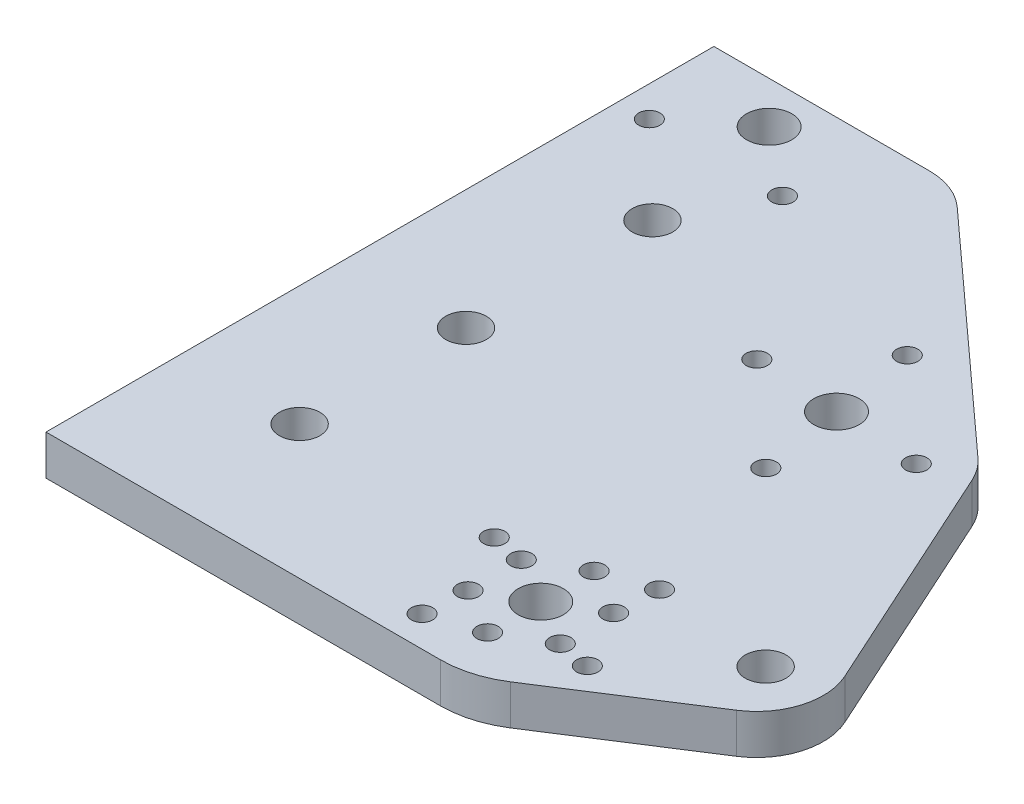
ISO-10303-21;
HEADER;
FILE_DESCRIPTION(('STEP AP214'),'2;1');
FILE_NAME('part.step','',(''),(''),'','','');
FILE_SCHEMA(('AUTOMOTIVE_DESIGN { 1 0 10303 214 1 1 1 1 }'));
ENDSEC;
DATA;
#1=APPLICATION_CONTEXT('core data for automotive mechanical design processes');
#2=APPLICATION_PROTOCOL_DEFINITION('international standard','automotive_design',2000,#1);
#3=PRODUCT_CONTEXT('',#1,'mechanical');
#4=PRODUCT('Part','Part','',(#3));
#5=PRODUCT_RELATED_PRODUCT_CATEGORY('part','',(#4));
#6=PRODUCT_DEFINITION_FORMATION('','',#4);
#7=PRODUCT_DEFINITION_CONTEXT('part definition',#1,'design');
#8=PRODUCT_DEFINITION('design','',#6,#7);
#9=PRODUCT_DEFINITION_SHAPE('','',#8);
#10=(LENGTH_UNIT() NAMED_UNIT(*) SI_UNIT(.MILLI.,.METRE.));
#11=(NAMED_UNIT(*) PLANE_ANGLE_UNIT() SI_UNIT($,.RADIAN.));
#12=(NAMED_UNIT(*) SI_UNIT($,.STERADIAN.) SOLID_ANGLE_UNIT());
#13=UNCERTAINTY_MEASURE_WITH_UNIT(LENGTH_MEASURE(1.E-05),#10,'distance_accuracy_value','');
#14=(GEOMETRIC_REPRESENTATION_CONTEXT(3) GLOBAL_UNCERTAINTY_ASSIGNED_CONTEXT((#13)) GLOBAL_UNIT_ASSIGNED_CONTEXT((#10,
#11,#12)) REPRESENTATION_CONTEXT('',''));
#15=CARTESIAN_POINT('',(0.,0.,0.));
#16=DIRECTION('',(0.,0.,1.));
#17=DIRECTION('',(1.,0.,0.));
#18=AXIS2_PLACEMENT_3D('',#15,#16,#17);
#19=CARTESIAN_POINT('',(0.,0.,-51.3));
#20=DIRECTION('',(0.,0.,-1.));
#21=DIRECTION('',(-1.,0.,0.));
#22=AXIS2_PLACEMENT_3D('',#19,#20,#21);
#23=PLANE('',#22);
#24=DIRECTION('',(1.,0.,0.));
#25=VECTOR('',#24,1.);
#26=CARTESIAN_POINT('',(0.,-6.,-51.3));
#27=LINE('',#26,#25);
#28=CARTESIAN_POINT('',(75.4374299499424,-6.,-51.3));
#29=VERTEX_POINT('',#28);
#30=CARTESIAN_POINT('',(107.856417313653,-6.,-51.3));
#31=VERTEX_POINT('',#30);
#32=EDGE_CURVE('E206',#29,#31,#27,.T.);
#33=ORIENTED_EDGE('',*,*,#32,.F.);
#34=DIRECTION('',(0.,-1.,0.));
#35=VECTOR('',#34,1.);
#36=CARTESIAN_POINT('',(75.4374299499424,0.,-51.3));
#37=LINE('',#36,#35);
#38=CARTESIAN_POINT('',(75.4374299499424,0.,-51.3));
#39=VERTEX_POINT('',#38);
#40=EDGE_CURVE('E11',#39,#29,#37,.T.);
#41=ORIENTED_EDGE('',*,*,#40,.F.);
#42=DIRECTION('',(1.,0.,0.));
#43=VECTOR('',#42,1.);
#44=CARTESIAN_POINT('',(0.,0.,-51.3));
#45=LINE('',#44,#43);
#46=CARTESIAN_POINT('',(107.856417313653,0.,-51.3));
#47=VERTEX_POINT('',#46);
#48=EDGE_CURVE('E245',#39,#47,#45,.T.);
#49=ORIENTED_EDGE('',*,*,#48,.T.);
#50=DIRECTION('',(0.,-1.,0.));
#51=VECTOR('',#50,1.);
#52=CARTESIAN_POINT('',(107.856417313653,0.,-51.3));
#53=LINE('',#52,#51);
#54=EDGE_CURVE('E39',#47,#31,#53,.T.);
#55=ORIENTED_EDGE('',*,*,#54,.T.);
#56=EDGE_LOOP('',(#33,#41,#49,#55));
#57=FACE_BOUND('',#56,.T.);
#58=ADVANCED_FACE('F35',(#57),#23,.T.);
#59=CARTESIAN_POINT('',(75.4374299499424,0.,0.));
#60=DIRECTION('',(-1.,0.,0.));
#61=DIRECTION('',(0.,0.,1.));
#62=AXIS2_PLACEMENT_3D('',#59,#60,#61);
#63=PLANE('',#62);
#64=DIRECTION('',(0.,0.,-1.));
#65=VECTOR('',#64,1.);
#66=CARTESIAN_POINT('',(75.4374299499424,-6.,0.));
#67=LINE('',#66,#65);
#68=CARTESIAN_POINT('',(75.4374299499424,-6.,49.0269199289563));
#69=VERTEX_POINT('',#68);
#70=EDGE_CURVE('E230',#69,#29,#67,.T.);
#71=ORIENTED_EDGE('',*,*,#70,.F.);
#72=DIRECTION('',(0.,-1.,0.));
#73=VECTOR('',#72,1.);
#74=CARTESIAN_POINT('',(75.4374299499424,0.,49.0269199289563));
#75=LINE('',#74,#73);
#76=CARTESIAN_POINT('',(75.4374299499424,0.,49.0269199289563));
#77=VERTEX_POINT('',#76);
#78=EDGE_CURVE('E45',#77,#69,#75,.T.);
#79=ORIENTED_EDGE('',*,*,#78,.F.);
#80=DIRECTION('',(0.,0.,-1.));
#81=VECTOR('',#80,1.);
#82=CARTESIAN_POINT('',(75.4374299499424,0.,0.));
#83=LINE('',#82,#81);
#84=EDGE_CURVE('E135',#77,#39,#83,.T.);
#85=ORIENTED_EDGE('',*,*,#84,.T.);
#86=ORIENTED_EDGE('',*,*,#40,.T.);
#87=EDGE_LOOP('',(#71,#79,#85,#86));
#88=FACE_BOUND('',#87,.T.);
#89=ADVANCED_FACE('F249',(#88),#63,.T.);
#90=CARTESIAN_POINT('',(0.,0.,49.0269199289563));
#91=DIRECTION('',(0.,0.,1.));
#92=DIRECTION('',(1.,0.,0.));
#93=AXIS2_PLACEMENT_3D('',#90,#91,#92);
#94=PLANE('',#93);
#95=DIRECTION('',(-1.,0.,0.));
#96=VECTOR('',#95,1.);
#97=CARTESIAN_POINT('',(0.,-6.,49.0269199289563));
#98=LINE('',#97,#96);
#99=CARTESIAN_POINT('',(134.666145804438,-6.,49.0269199289563));
#100=VERTEX_POINT('',#99);
#101=EDGE_CURVE('E122',#100,#69,#98,.T.);
#102=ORIENTED_EDGE('',*,*,#101,.F.);
#103=DIRECTION('',(0.,-1.,0.));
#104=VECTOR('',#103,1.);
#105=CARTESIAN_POINT('',(134.666145804438,0.,49.0269199289563));
#106=LINE('',#105,#104);
#107=CARTESIAN_POINT('',(134.666145804438,0.,49.0269199289563));
#108=VERTEX_POINT('',#107);
#109=EDGE_CURVE('E117',#108,#100,#106,.T.);
#110=ORIENTED_EDGE('',*,*,#109,.F.);
#111=DIRECTION('',(-1.,0.,0.));
#112=VECTOR('',#111,1.);
#113=CARTESIAN_POINT('',(0.,0.,49.0269199289563));
#114=LINE('',#113,#112);
#115=EDGE_CURVE('E120',#108,#77,#114,.T.);
#116=ORIENTED_EDGE('',*,*,#115,.T.);
#117=ORIENTED_EDGE('',*,*,#78,.T.);
#118=EDGE_LOOP('',(#102,#110,#116,#117));
#119=FACE_BOUND('',#118,.T.);
#120=ADVANCED_FACE('F119',(#119),#94,.T.);
#121=CARTESIAN_POINT('',(134.666145804438,0.,33.9329989561975));
#122=DIRECTION('',(0.,-1.,0.));
#123=DIRECTION('',(0.,0.,-1.));
#124=AXIS2_PLACEMENT_3D('',#121,#122,#123);
#125=CYLINDRICAL_SURFACE('',#124,15.0939209727588);
#126=CARTESIAN_POINT('',(134.666145804438,-6.,33.9329989561975));
#127=DIRECTION('',(0.,-1.,0.));
#128=DIRECTION('',(0.,0.,-1.));
#129=AXIS2_PLACEMENT_3D('',#126,#127,#128);
#130=CIRCLE('',#129,15.0939209727588);
#131=CARTESIAN_POINT('',(142.828800475843,-6.,46.6293574517381));
#132=VERTEX_POINT('',#131);
#133=EDGE_CURVE('E227',#132,#100,#130,.T.);
#134=ORIENTED_EDGE('',*,*,#133,.F.);
#135=DIRECTION('',(0.,-1.,0.));
#136=VECTOR('',#135,1.);
#137=CARTESIAN_POINT('',(142.828800475843,0.,46.6293574517381));
#138=LINE('',#137,#136);
#139=CARTESIAN_POINT('',(142.828800475843,0.,46.6293574517381));
#140=VERTEX_POINT('',#139);
#141=EDGE_CURVE('E127',#140,#132,#138,.T.);
#142=ORIENTED_EDGE('',*,*,#141,.F.);
#143=CARTESIAN_POINT('',(134.666145804438,0.,33.9329989561975));
#144=DIRECTION('',(0.,-1.,0.));
#145=DIRECTION('',(0.,0.,-1.));
#146=AXIS2_PLACEMENT_3D('',#143,#144,#145);
#147=CIRCLE('',#146,15.0939209727588);
#148=EDGE_CURVE('E133',#140,#108,#147,.T.);
#149=ORIENTED_EDGE('',*,*,#148,.T.);
#150=ORIENTED_EDGE('',*,*,#109,.T.);
#151=EDGE_LOOP('',(#134,#142,#149,#150));
#152=FACE_BOUND('',#151,.T.);
#153=ADVANCED_FACE('F137',(#152),#125,.T.);
#154=CARTESIAN_POINT('',(62.9821951457657,0.,97.9637826904602));
#155=DIRECTION('',(0.540790871115351,0.,0.841157080287802));
#156=DIRECTION('',(0.841157080287802,0.,-0.540790871115351));
#157=AXIS2_PLACEMENT_3D('',#154,#155,#156);
#158=PLANE('',#157);
#159=DIRECTION('',(-0.841157080287802,0.,0.540790871115351));
#160=VECTOR('',#159,1.);
#161=CARTESIAN_POINT('',(62.9821951457657,-6.,97.9637826904602));
#162=LINE('',#161,#160);
#163=CARTESIAN_POINT('',(163.500492356446,-6.,33.3392568016729));
#164=VERTEX_POINT('',#163);
#165=EDGE_CURVE('E224',#164,#132,#162,.T.);
#166=ORIENTED_EDGE('',*,*,#165,.F.);
#167=DIRECTION('',(0.,-1.,0.));
#168=VECTOR('',#167,1.);
#169=CARTESIAN_POINT('',(163.500492356446,0.,33.3392568016729));
#170=LINE('',#169,#168);
#171=CARTESIAN_POINT('',(163.500492356446,0.,33.3392568016729));
#172=VERTEX_POINT('',#171);
#173=EDGE_CURVE('E236',#172,#164,#170,.T.);
#174=ORIENTED_EDGE('',*,*,#173,.F.);
#175=DIRECTION('',(-0.841157080287802,0.,0.540790871115351));
#176=VECTOR('',#175,1.);
#177=CARTESIAN_POINT('',(62.9821951457657,0.,97.9637826904602));
#178=LINE('',#177,#176);
#179=EDGE_CURVE('E138',#172,#140,#178,.T.);
#180=ORIENTED_EDGE('',*,*,#179,.T.);
#181=ORIENTED_EDGE('',*,*,#141,.T.);
#182=EDGE_LOOP('',(#166,#174,#180,#181));
#183=FACE_BOUND('',#182,.T.);
#184=ADVANCED_FACE('F263',(#183),#158,.T.);
#185=CARTESIAN_POINT('',(158.092583645293,0.,24.9276859987951));
#186=DIRECTION('',(0.,-1.,0.));
#187=DIRECTION('',(0.,0.,-1.));
#188=AXIS2_PLACEMENT_3D('',#185,#186,#187);
#189=CYLINDRICAL_SURFACE('',#188,9.99999999999987);
#190=CARTESIAN_POINT('',(158.092583645293,-6.,24.9276859987951));
#191=DIRECTION('',(0.,-1.,0.));
#192=DIRECTION('',(0.,0.,-1.));
#193=AXIS2_PLACEMENT_3D('',#190,#191,#192);
#194=CIRCLE('',#193,9.99999999999987);
#195=CARTESIAN_POINT('',(167.194797105098,-6.,20.7864651483518));
#196=VERTEX_POINT('',#195);
#197=EDGE_CURVE('E221',#196,#164,#194,.T.);
#198=ORIENTED_EDGE('',*,*,#197,.F.);
#199=DIRECTION('',(0.,-1.,0.));
#200=VECTOR('',#199,1.);
#201=CARTESIAN_POINT('',(167.194797105098,0.,20.7864651483518));
#202=LINE('',#201,#200);
#203=CARTESIAN_POINT('',(167.194797105098,0.,20.7864651483518));
#204=VERTEX_POINT('',#203);
#205=EDGE_CURVE('E238',#204,#196,#202,.T.);
#206=ORIENTED_EDGE('',*,*,#205,.F.);
#207=CARTESIAN_POINT('',(158.092583645293,0.,24.9276859987951));
#208=DIRECTION('',(0.,-1.,0.));
#209=DIRECTION('',(0.,0.,-1.));
#210=AXIS2_PLACEMENT_3D('',#207,#208,#209);
#211=CIRCLE('',#210,9.99999999999987);
#212=EDGE_CURVE('E140',#204,#172,#211,.T.);
#213=ORIENTED_EDGE('',*,*,#212,.T.);
#214=ORIENTED_EDGE('',*,*,#173,.T.);
#215=EDGE_LOOP('',(#198,#206,#213,#214));
#216=FACE_BOUND('',#215,.T.);
#217=ADVANCED_FACE('F266',(#216),#189,.T.);
#218=CARTESIAN_POINT('',(130.686066467596,0.,-59.4580500345281));
#219=DIRECTION('',(0.910221345980489,0.,-0.414122085044335));
#220=DIRECTION('',(-0.414122085044335,0.,-0.910221345980489));
#221=AXIS2_PLACEMENT_3D('',#218,#219,#220);
#222=PLANE('',#221);
#223=DIRECTION('',(0.414122085044335,0.,0.910221345980489));
#224=VECTOR('',#223,1.);
#225=CARTESIAN_POINT('',(130.686066467596,-6.,-59.4580500345281));
#226=LINE('',#225,#224);
#227=CARTESIAN_POINT('',(151.23570711883,-6.,-14.2908825530368));
#228=VERTEX_POINT('',#227);
#229=EDGE_CURVE('E218',#228,#196,#226,.T.);
#230=ORIENTED_EDGE('',*,*,#229,.F.);
#231=DIRECTION('',(0.,-1.,0.));
#232=VECTOR('',#231,1.);
#233=CARTESIAN_POINT('',(151.23570711883,0.,-14.2908825530368));
#234=LINE('',#233,#232);
#235=CARTESIAN_POINT('',(151.23570711883,0.,-14.2908825530368));
#236=VERTEX_POINT('',#235);
#237=EDGE_CURVE('E240',#236,#228,#234,.T.);
#238=ORIENTED_EDGE('',*,*,#237,.F.);
#239=DIRECTION('',(0.414122085044335,0.,0.910221345980489));
#240=VECTOR('',#239,1.);
#241=CARTESIAN_POINT('',(130.686066467596,0.,-59.4580500345281));
#242=LINE('',#241,#240);
#243=EDGE_CURVE('E526',#236,#204,#242,.T.);
#244=ORIENTED_EDGE('',*,*,#243,.T.);
#245=ORIENTED_EDGE('',*,*,#205,.T.);
#246=EDGE_LOOP('',(#230,#238,#244,#245));
#247=FACE_BOUND('',#246,.T.);
#248=ADVANCED_FACE('F270',(#247),#222,.T.);
#249=CARTESIAN_POINT('',(142.133493659026,0.,-10.1496617025925));
#250=DIRECTION('',(0.,-1.,0.));
#251=DIRECTION('',(0.,0.,-1.));
#252=AXIS2_PLACEMENT_3D('',#249,#250,#251);
#253=CYLINDRICAL_SURFACE('',#252,9.99999999999989);
#254=CARTESIAN_POINT('',(142.133493659026,-6.,-10.1496617025925));
#255=DIRECTION('',(0.,-1.,0.));
#256=DIRECTION('',(0.,0.,-1.));
#257=AXIS2_PLACEMENT_3D('',#254,#255,#256);
#258=CIRCLE('',#257,9.99999999999989);
#259=CARTESIAN_POINT('',(148.858963727558,-6.,-17.5502057607874));
#260=VERTEX_POINT('',#259);
#261=EDGE_CURVE('E215',#260,#228,#258,.T.);
#262=ORIENTED_EDGE('',*,*,#261,.F.);
#263=DIRECTION('',(0.,-1.,0.));
#264=VECTOR('',#263,1.);
#265=CARTESIAN_POINT('',(148.858963727558,0.,-17.5502057607874));
#266=LINE('',#265,#264);
#267=CARTESIAN_POINT('',(148.858963727558,0.,-17.5502057607874));
#268=VERTEX_POINT('',#267);
#269=EDGE_CURVE('E242',#268,#260,#266,.T.);
#270=ORIENTED_EDGE('',*,*,#269,.F.);
#271=CARTESIAN_POINT('',(142.133493659026,0.,-10.1496617025925));
#272=DIRECTION('',(0.,-1.,0.));
#273=DIRECTION('',(0.,0.,-1.));
#274=AXIS2_PLACEMENT_3D('',#271,#272,#273);
#275=CIRCLE('',#274,9.99999999999989);
#276=EDGE_CURVE('E523',#268,#236,#275,.T.);
#277=ORIENTED_EDGE('',*,*,#276,.T.);
#278=ORIENTED_EDGE('',*,*,#237,.T.);
#279=EDGE_LOOP('',(#262,#270,#277,#278));
#280=FACE_BOUND('',#279,.T.);
#281=ADVANCED_FACE('F274',(#280),#253,.T.);
#282=CARTESIAN_POINT('',(76.0669210870679,0.,-83.7021940681753));
#283=DIRECTION('',(0.67254700685326,0.,-0.740054405819411));
#284=DIRECTION('',(-0.740054405819411,0.,-0.67254700685326));
#285=AXIS2_PLACEMENT_3D('',#282,#283,#284);
#286=PLANE('',#285);
#287=DIRECTION('',(0.740054405819411,0.,0.67254700685326));
#288=VECTOR('',#287,1.);
#289=CARTESIAN_POINT('',(76.0669210870679,-6.,-83.7021940681753));
#290=LINE('',#289,#288);
#291=CARTESIAN_POINT('',(114.581887382186,-6.,-48.7005440581941));
#292=VERTEX_POINT('',#291);
#293=EDGE_CURVE('E212',#292,#260,#290,.T.);
#294=ORIENTED_EDGE('',*,*,#293,.F.);
#295=DIRECTION('',(0.,-1.,0.));
#296=VECTOR('',#295,1.);
#297=CARTESIAN_POINT('',(114.581887382186,0.,-48.7005440581941));
#298=LINE('',#297,#296);
#299=CARTESIAN_POINT('',(114.581887382186,0.,-48.7005440581941));
#300=VERTEX_POINT('',#299);
#301=EDGE_CURVE('E243',#300,#292,#298,.T.);
#302=ORIENTED_EDGE('',*,*,#301,.F.);
#303=DIRECTION('',(0.740054405819411,0.,0.67254700685326));
#304=VECTOR('',#303,1.);
#305=CARTESIAN_POINT('',(76.0669210870679,0.,-83.7021940681753));
#306=LINE('',#305,#304);
#307=EDGE_CURVE('E520',#300,#268,#306,.T.);
#308=ORIENTED_EDGE('',*,*,#307,.T.);
#309=ORIENTED_EDGE('',*,*,#269,.T.);
#310=EDGE_LOOP('',(#294,#302,#308,#309));
#311=FACE_BOUND('',#310,.T.);
#312=ADVANCED_FACE('F278',(#311),#286,.T.);
#313=CARTESIAN_POINT('',(132.157379949944,0.,-12.9999999999985));
#314=DIRECTION('',(0.,-1.,0.));
#315=DIRECTION('',(0.,0.,-1.));
#316=AXIS2_PLACEMENT_3D('',#313,#314,#315);
#317=CYLINDRICAL_SURFACE('',#316,3.40000000000148);
#318=CARTESIAN_POINT('',(132.157379949944,0.,-12.9999999999985));
#319=DIRECTION('',(0.,-1.,0.));
#320=DIRECTION('',(0.,0.,-1.));
#321=AXIS2_PLACEMENT_3D('',#318,#319,#320);
#322=CIRCLE('',#321,3.40000000000148);
#323=CARTESIAN_POINT('',(132.157379949944,0.,-16.4));
#324=VERTEX_POINT('',#323);
#325=EDGE_CURVE('E514',#324,#324,#322,.F.);
#326=ORIENTED_EDGE('',*,*,#325,.T.);
#327=EDGE_LOOP('',(#326));
#328=FACE_BOUND('',#327,.T.);
#329=CARTESIAN_POINT('',(132.157379949944,-6.,-12.9999999999985));
#330=DIRECTION('',(0.,-1.,0.));
#331=DIRECTION('',(0.,0.,-1.));
#332=AXIS2_PLACEMENT_3D('',#329,#330,#331);
#333=CIRCLE('',#332,3.40000000000148);
#334=CARTESIAN_POINT('',(132.157379949944,-6.,-16.4));
#335=VERTEX_POINT('',#334);
#336=EDGE_CURVE('E203',#335,#335,#333,.F.);
#337=ORIENTED_EDGE('',*,*,#336,.F.);
#338=EDGE_LOOP('',(#337));
#339=FACE_BOUND('',#338,.T.);
#340=ADVANCED_FACE('F282',(#328,#339),#317,.F.);
#341=CARTESIAN_POINT('',(141.594349034714,0.,37.9329989561976));
#342=DIRECTION('',(0.,-1.,0.));
#343=DIRECTION('',(0.,0.,-1.));
#344=AXIS2_PLACEMENT_3D('',#341,#342,#343);
#345=CYLINDRICAL_SURFACE('',#344,1.59999999999999);
#346=CARTESIAN_POINT('',(141.594349034714,0.,37.9329989561976));
#347=DIRECTION('',(0.,-1.,0.));
#348=DIRECTION('',(0.,0.,-1.));
#349=AXIS2_PLACEMENT_3D('',#346,#347,#348);
#350=CIRCLE('',#349,1.59999999999999);
#351=CARTESIAN_POINT('',(141.594349034714,0.,36.3329989561976));
#352=VERTEX_POINT('',#351);
#353=EDGE_CURVE('E511',#352,#352,#350,.F.);
#354=ORIENTED_EDGE('',*,*,#353,.T.);
#355=EDGE_LOOP('',(#354));
#356=FACE_BOUND('',#355,.T.);
#357=CARTESIAN_POINT('',(141.594349034714,-6.,37.9329989561976));
#358=DIRECTION('',(0.,-1.,0.));
#359=DIRECTION('',(0.,0.,-1.));
#360=AXIS2_PLACEMENT_3D('',#357,#358,#359);
#361=CIRCLE('',#360,1.59999999999999);
#362=CARTESIAN_POINT('',(141.594349034714,-6.,36.3329989561976));
#363=VERTEX_POINT('',#362);
#364=EDGE_CURVE('E200',#363,#363,#361,.F.);
#365=ORIENTED_EDGE('',*,*,#364,.F.);
#366=EDGE_LOOP('',(#365));
#367=FACE_BOUND('',#366,.T.);
#368=ADVANCED_FACE('F288',(#356,#367),#345,.F.);
#369=CARTESIAN_POINT('',(127.737942574163,0.,37.9329989561976));
#370=DIRECTION('',(0.,-1.,0.));
#371=DIRECTION('',(0.,0.,-1.));
#372=AXIS2_PLACEMENT_3D('',#369,#370,#371);
#373=CYLINDRICAL_SURFACE('',#372,1.59999999999999);
#374=CARTESIAN_POINT('',(127.737942574163,0.,37.9329989561976));
#375=DIRECTION('',(0.,-1.,0.));
#376=DIRECTION('',(0.,0.,-1.));
#377=AXIS2_PLACEMENT_3D('',#374,#375,#376);
#378=CIRCLE('',#377,1.59999999999999);
#379=CARTESIAN_POINT('',(127.737942574163,0.,36.3329989561976));
#380=VERTEX_POINT('',#379);
#381=EDGE_CURVE('E508',#380,#380,#378,.F.);
#382=ORIENTED_EDGE('',*,*,#381,.T.);
#383=EDGE_LOOP('',(#382));
#384=FACE_BOUND('',#383,.T.);
#385=CARTESIAN_POINT('',(127.737942574163,-6.,37.9329989561976));
#386=DIRECTION('',(0.,-1.,0.));
#387=DIRECTION('',(0.,0.,-1.));
#388=AXIS2_PLACEMENT_3D('',#385,#386,#387);
#389=CIRCLE('',#388,1.59999999999999);
#390=CARTESIAN_POINT('',(127.737942574163,-6.,36.3329989561976));
#391=VERTEX_POINT('',#390);
#392=EDGE_CURVE('E197',#391,#391,#389,.F.);
#393=ORIENTED_EDGE('',*,*,#392,.F.);
#394=EDGE_LOOP('',(#393));
#395=FACE_BOUND('',#394,.T.);
#396=ADVANCED_FACE('F292',(#384,#395),#373,.F.);
#397=CARTESIAN_POINT('',(134.666145804438,0.,25.9329989561974));
#398=DIRECTION('',(0.,-1.,0.));
#399=DIRECTION('',(0.,0.,-1.));
#400=AXIS2_PLACEMENT_3D('',#397,#398,#399);
#401=CYLINDRICAL_SURFACE('',#400,1.59999999999999);
#402=CARTESIAN_POINT('',(134.666145804438,0.,25.9329989561974));
#403=DIRECTION('',(0.,-1.,0.));
#404=DIRECTION('',(0.,0.,-1.));
#405=AXIS2_PLACEMENT_3D('',#402,#403,#404);
#406=CIRCLE('',#405,1.59999999999999);
#407=CARTESIAN_POINT('',(134.666145804438,0.,24.3329989561975));
#408=VERTEX_POINT('',#407);
#409=EDGE_CURVE('E505',#408,#408,#406,.F.);
#410=ORIENTED_EDGE('',*,*,#409,.T.);
#411=EDGE_LOOP('',(#410));
#412=FACE_BOUND('',#411,.T.);
#413=CARTESIAN_POINT('',(134.666145804438,-6.,25.9329989561974));
#414=DIRECTION('',(0.,-1.,0.));
#415=DIRECTION('',(0.,0.,-1.));
#416=AXIS2_PLACEMENT_3D('',#413,#414,#415);
#417=CIRCLE('',#416,1.59999999999999);
#418=CARTESIAN_POINT('',(134.666145804438,-6.,24.3329989561975));
#419=VERTEX_POINT('',#418);
#420=EDGE_CURVE('E194',#419,#419,#417,.F.);
#421=ORIENTED_EDGE('',*,*,#420,.F.);
#422=EDGE_LOOP('',(#421));
#423=FACE_BOUND('',#422,.T.);
#424=ADVANCED_FACE('F296',(#412,#423),#401,.F.);
#425=CARTESIAN_POINT('',(134.177547953312,0.,-0.354094684910602));
#426=DIRECTION('',(0.,-1.,0.));
#427=DIRECTION('',(0.,0.,-1.));
#428=AXIS2_PLACEMENT_3D('',#425,#426,#427);
#429=CYLINDRICAL_SURFACE('',#428,1.59999999999997);
#430=CARTESIAN_POINT('',(134.177547953312,0.,-0.354094684910602));
#431=DIRECTION('',(0.,-1.,0.));
#432=DIRECTION('',(0.,0.,-1.));
#433=AXIS2_PLACEMENT_3D('',#430,#431,#432);
#434=CIRCLE('',#433,1.59999999999997);
#435=CARTESIAN_POINT('',(134.177547953312,0.,-1.95409468491057));
#436=VERTEX_POINT('',#435);
#437=EDGE_CURVE('E502',#436,#436,#434,.F.);
#438=ORIENTED_EDGE('',*,*,#437,.T.);
#439=EDGE_LOOP('',(#438));
#440=FACE_BOUND('',#439,.T.);
#441=CARTESIAN_POINT('',(134.177547953312,-6.,-0.354094684910602));
#442=DIRECTION('',(0.,-1.,0.));
#443=DIRECTION('',(0.,0.,-1.));
#444=AXIS2_PLACEMENT_3D('',#441,#442,#443);
#445=CIRCLE('',#444,1.59999999999997);
#446=CARTESIAN_POINT('',(134.177547953312,-6.,-1.95409468491057));
#447=VERTEX_POINT('',#446);
#448=EDGE_CURVE('E191',#447,#447,#445,.F.);
#449=ORIENTED_EDGE('',*,*,#448,.F.);
#450=EDGE_LOOP('',(#449));
#451=FACE_BOUND('',#450,.T.);
#452=ADVANCED_FACE('F300',(#440,#451),#429,.F.);
#453=CARTESIAN_POINT('',(130.137211946576,0.,-25.6459053150864));
#454=DIRECTION('',(0.,-1.,0.));
#455=DIRECTION('',(0.,0.,-1.));
#456=AXIS2_PLACEMENT_3D('',#453,#454,#455);
#457=CYLINDRICAL_SURFACE('',#456,1.59999999999991);
#458=CARTESIAN_POINT('',(130.137211946576,0.,-25.6459053150864));
#459=DIRECTION('',(0.,-1.,0.));
#460=DIRECTION('',(0.,0.,-1.));
#461=AXIS2_PLACEMENT_3D('',#458,#459,#460);
#462=CIRCLE('',#461,1.59999999999991);
#463=CARTESIAN_POINT('',(130.137211946576,0.,-27.2459053150864));
#464=VERTEX_POINT('',#463);
#465=EDGE_CURVE('E499',#464,#464,#462,.F.);
#466=ORIENTED_EDGE('',*,*,#465,.T.);
#467=EDGE_LOOP('',(#466));
#468=FACE_BOUND('',#467,.T.);
#469=CARTESIAN_POINT('',(130.137211946576,-6.,-25.6459053150864));
#470=DIRECTION('',(0.,-1.,0.));
#471=DIRECTION('',(0.,0.,-1.));
#472=AXIS2_PLACEMENT_3D('',#469,#470,#471);
#473=CIRCLE('',#472,1.59999999999991);
#474=CARTESIAN_POINT('',(130.137211946576,-6.,-27.2459053150864));
#475=VERTEX_POINT('',#474);
#476=EDGE_CURVE('E188',#475,#475,#473,.F.);
#477=ORIENTED_EDGE('',*,*,#476,.F.);
#478=EDGE_LOOP('',(#477));
#479=FACE_BOUND('',#478,.T.);
#480=ADVANCED_FACE('F304',(#468,#479),#457,.F.);
#481=CARTESIAN_POINT('',(122.816922322099,0.,29.0754375447904));
#482=DIRECTION('',(0.,-1.,0.));
#483=DIRECTION('',(0.,0.,-1.));
#484=AXIS2_PLACEMENT_3D('',#481,#482,#483);
#485=CYLINDRICAL_SURFACE('',#484,1.60000000000009);
#486=CARTESIAN_POINT('',(122.816922322099,0.,29.0754375447904));
#487=DIRECTION('',(0.,-1.,0.));
#488=DIRECTION('',(0.,0.,-1.));
#489=AXIS2_PLACEMENT_3D('',#486,#487,#488);
#490=CIRCLE('',#489,1.60000000000009);
#491=CARTESIAN_POINT('',(122.816922322099,0.,27.4754375447903));
#492=VERTEX_POINT('',#491);
#493=EDGE_CURVE('E496',#492,#492,#490,.F.);
#494=ORIENTED_EDGE('',*,*,#493,.T.);
#495=EDGE_LOOP('',(#494));
#496=FACE_BOUND('',#495,.T.);
#497=CARTESIAN_POINT('',(122.816922322099,-6.,29.0754375447904));
#498=DIRECTION('',(0.,-1.,0.));
#499=DIRECTION('',(0.,0.,-1.));
#500=AXIS2_PLACEMENT_3D('',#497,#498,#499);
#501=CIRCLE('',#500,1.60000000000009);
#502=CARTESIAN_POINT('',(122.816922322099,-6.,27.4754375447903));
#503=VERTEX_POINT('',#502);
#504=EDGE_CURVE('E185',#503,#503,#501,.F.);
#505=ORIENTED_EDGE('',*,*,#504,.F.);
#506=EDGE_LOOP('',(#505));
#507=FACE_BOUND('',#506,.T.);
#508=ADVANCED_FACE('F308',(#496,#507),#485,.F.);
#509=CARTESIAN_POINT('',(80.0374299499424,0.,-37.));
#510=DIRECTION('',(0.,-1.,0.));
#511=DIRECTION('',(0.,0.,-1.));
#512=AXIS2_PLACEMENT_3D('',#509,#510,#511);
#513=CYLINDRICAL_SURFACE('',#512,1.60000000000001);
#514=CARTESIAN_POINT('',(80.0374299499424,0.,-37.));
#515=DIRECTION('',(0.,-1.,0.));
#516=DIRECTION('',(0.,0.,-1.));
#517=AXIS2_PLACEMENT_3D('',#514,#515,#516);
#518=CIRCLE('',#517,1.60000000000001);
#519=CARTESIAN_POINT('',(80.0374299499424,0.,-38.6));
#520=VERTEX_POINT('',#519);
#521=EDGE_CURVE('E493',#520,#520,#518,.F.);
#522=ORIENTED_EDGE('',*,*,#521,.T.);
#523=EDGE_LOOP('',(#522));
#524=FACE_BOUND('',#523,.T.);
#525=CARTESIAN_POINT('',(80.0374299499424,-6.,-37.));
#526=DIRECTION('',(0.,-1.,0.));
#527=DIRECTION('',(0.,0.,-1.));
#528=AXIS2_PLACEMENT_3D('',#525,#526,#527);
#529=CIRCLE('',#528,1.60000000000001);
#530=CARTESIAN_POINT('',(80.0374299499424,-6.,-38.6));
#531=VERTEX_POINT('',#530);
#532=EDGE_CURVE('E182',#531,#531,#529,.F.);
#533=ORIENTED_EDGE('',*,*,#532,.F.);
#534=EDGE_LOOP('',(#533));
#535=FACE_BOUND('',#534,.T.);
#536=ADVANCED_FACE('F312',(#524,#535),#513,.F.);
#537=CARTESIAN_POINT('',(100.037429949942,0.,-37.));
#538=DIRECTION('',(0.,-1.,0.));
#539=DIRECTION('',(0.,0.,-1.));
#540=AXIS2_PLACEMENT_3D('',#537,#538,#539);
#541=CYLINDRICAL_SURFACE('',#540,1.60000000000001);
#542=CARTESIAN_POINT('',(100.037429949942,0.,-37.));
#543=DIRECTION('',(0.,-1.,0.));
#544=DIRECTION('',(0.,0.,-1.));
#545=AXIS2_PLACEMENT_3D('',#542,#543,#544);
#546=CIRCLE('',#545,1.60000000000001);
#547=CARTESIAN_POINT('',(100.037429949942,0.,-38.6));
#548=VERTEX_POINT('',#547);
#549=EDGE_CURVE('E490',#548,#548,#546,.F.);
#550=ORIENTED_EDGE('',*,*,#549,.T.);
#551=EDGE_LOOP('',(#550));
#552=FACE_BOUND('',#551,.T.);
#553=CARTESIAN_POINT('',(100.037429949942,-6.,-37.));
#554=DIRECTION('',(0.,-1.,0.));
#555=DIRECTION('',(0.,0.,-1.));
#556=AXIS2_PLACEMENT_3D('',#553,#554,#555);
#557=CIRCLE('',#556,1.60000000000001);
#558=CARTESIAN_POINT('',(100.037429949942,-6.,-38.6));
#559=VERTEX_POINT('',#558);
#560=EDGE_CURVE('E179',#559,#559,#557,.F.);
#561=ORIENTED_EDGE('',*,*,#560,.F.);
#562=EDGE_LOOP('',(#561));
#563=FACE_BOUND('',#562,.T.);
#564=ADVANCED_FACE('F316',(#552,#563),#541,.F.);
#565=CARTESIAN_POINT('',(142.006279165349,0.,23.4390748930051));
#566=DIRECTION('',(0.,-1.,0.));
#567=DIRECTION('',(0.,0.,-1.));
#568=AXIS2_PLACEMENT_3D('',#565,#566,#567);
#569=CYLINDRICAL_SURFACE('',#568,1.5999999999999);
#570=CARTESIAN_POINT('',(142.006279165349,0.,23.4390748930051));
#571=DIRECTION('',(0.,-1.,0.));
#572=DIRECTION('',(0.,0.,-1.));
#573=AXIS2_PLACEMENT_3D('',#570,#571,#572);
#574=CIRCLE('',#573,1.5999999999999);
#575=CARTESIAN_POINT('',(142.006279165349,0.,21.8390748930052));
#576=VERTEX_POINT('',#575);
#577=EDGE_CURVE('E487',#576,#576,#574,.F.);
#578=ORIENTED_EDGE('',*,*,#577,.T.);
#579=EDGE_LOOP('',(#578));
#580=FACE_BOUND('',#579,.T.);
#581=CARTESIAN_POINT('',(142.006279165349,-6.,23.4390748930051));
#582=DIRECTION('',(0.,-1.,0.));
#583=DIRECTION('',(0.,0.,-1.));
#584=AXIS2_PLACEMENT_3D('',#581,#582,#583);
#585=CIRCLE('',#584,1.5999999999999);
#586=CARTESIAN_POINT('',(142.006279165349,-6.,21.8390748930052));
#587=VERTEX_POINT('',#586);
#588=EDGE_CURVE('E176',#587,#587,#585,.F.);
#589=ORIENTED_EDGE('',*,*,#588,.F.);
#590=EDGE_LOOP('',(#589));
#591=FACE_BOUND('',#590,.T.);
#592=ADVANCED_FACE('F320',(#580,#591),#569,.F.);
#593=CARTESIAN_POINT('',(119.376459836924,0.,-13.8050348219758));
#594=DIRECTION('',(0.,-1.,0.));
#595=DIRECTION('',(0.,0.,-1.));
#596=AXIS2_PLACEMENT_3D('',#593,#594,#595);
#597=CYLINDRICAL_SURFACE('',#596,1.6);
#598=CARTESIAN_POINT('',(119.376459836924,0.,-13.8050348219758));
#599=DIRECTION('',(0.,-1.,0.));
#600=DIRECTION('',(0.,0.,-1.));
#601=AXIS2_PLACEMENT_3D('',#598,#599,#600);
#602=CIRCLE('',#601,1.6);
#603=CARTESIAN_POINT('',(119.376459836924,0.,-15.4050348219758));
#604=VERTEX_POINT('',#603);
#605=EDGE_CURVE('E484',#604,#604,#602,.F.);
#606=ORIENTED_EDGE('',*,*,#605,.T.);
#607=EDGE_LOOP('',(#606));
#608=FACE_BOUND('',#607,.T.);
#609=CARTESIAN_POINT('',(119.376459836924,-6.,-13.8050348219758));
#610=DIRECTION('',(0.,-1.,0.));
#611=DIRECTION('',(0.,0.,-1.));
#612=AXIS2_PLACEMENT_3D('',#609,#610,#611);
#613=CIRCLE('',#612,1.6);
#614=CARTESIAN_POINT('',(119.376459836924,-6.,-15.4050348219758));
#615=VERTEX_POINT('',#614);
#616=EDGE_CURVE('E173',#615,#615,#613,.F.);
#617=ORIENTED_EDGE('',*,*,#616,.F.);
#618=EDGE_LOOP('',(#617));
#619=FACE_BOUND('',#618,.T.);
#620=ADVANCED_FACE('F324',(#608,#619),#597,.F.);
#621=CARTESIAN_POINT('',(146.515369286777,0.,38.7905603676047));
#622=DIRECTION('',(0.,-1.,0.));
#623=DIRECTION('',(0.,0.,-1.));
#624=AXIS2_PLACEMENT_3D('',#621,#622,#623);
#625=CYLINDRICAL_SURFACE('',#624,1.59999999999991);
#626=CARTESIAN_POINT('',(146.515369286777,0.,38.7905603676047));
#627=DIRECTION('',(0.,-1.,0.));
#628=DIRECTION('',(0.,0.,-1.));
#629=AXIS2_PLACEMENT_3D('',#626,#627,#628);
#630=CIRCLE('',#629,1.59999999999991);
#631=CARTESIAN_POINT('',(146.515369286777,0.,37.1905603676048));
#632=VERTEX_POINT('',#631);
#633=EDGE_CURVE('E481',#632,#632,#630,.F.);
#634=ORIENTED_EDGE('',*,*,#633,.T.);
#635=EDGE_LOOP('',(#634));
#636=FACE_BOUND('',#635,.T.);
#637=CARTESIAN_POINT('',(146.515369286777,-6.,38.7905603676047));
#638=DIRECTION('',(0.,-1.,0.));
#639=DIRECTION('',(0.,0.,-1.));
#640=AXIS2_PLACEMENT_3D('',#637,#638,#639);
#641=CIRCLE('',#640,1.59999999999991);
#642=CARTESIAN_POINT('',(146.515369286777,-6.,37.1905603676048));
#643=VERTEX_POINT('',#642);
#644=EDGE_CURVE('E170',#643,#643,#641,.F.);
#645=ORIENTED_EDGE('',*,*,#644,.F.);
#646=EDGE_LOOP('',(#645));
#647=FACE_BOUND('',#646,.T.);
#648=ADVANCED_FACE('F328',(#636,#647),#625,.F.);
#649=CARTESIAN_POINT('',(159.995303963735,0.,25.4876601861212));
#650=DIRECTION('',(0.,-1.,0.));
#651=DIRECTION('',(0.,0.,-1.));
#652=AXIS2_PLACEMENT_3D('',#649,#650,#651);
#653=CYLINDRICAL_SURFACE('',#652,3.04999999999999);
#654=CARTESIAN_POINT('',(159.995303963735,0.,25.4876601861212));
#655=DIRECTION('',(0.,-1.,0.));
#656=DIRECTION('',(0.,0.,-1.));
#657=AXIS2_PLACEMENT_3D('',#654,#655,#656);
#658=CIRCLE('',#657,3.04999999999999);
#659=CARTESIAN_POINT('',(159.995303963735,0.,22.4376601861212));
#660=VERTEX_POINT('',#659);
#661=EDGE_CURVE('E478',#660,#660,#658,.F.);
#662=ORIENTED_EDGE('',*,*,#661,.T.);
#663=EDGE_LOOP('',(#662));
#664=FACE_BOUND('',#663,.T.);
#665=CARTESIAN_POINT('',(159.995303963735,-6.,25.4876601861212));
#666=DIRECTION('',(0.,-1.,0.));
#667=DIRECTION('',(0.,0.,-1.));
#668=AXIS2_PLACEMENT_3D('',#665,#666,#667);
#669=CIRCLE('',#668,3.04999999999999);
#670=CARTESIAN_POINT('',(159.995303963735,-6.,22.4376601861212));
#671=VERTEX_POINT('',#670);
#672=EDGE_CURVE('E167',#671,#671,#669,.F.);
#673=ORIENTED_EDGE('',*,*,#672,.F.);
#674=EDGE_LOOP('',(#673));
#675=FACE_BOUND('',#674,.T.);
#676=ADVANCED_FACE('F332',(#664,#675),#653,.F.);
#677=CARTESIAN_POINT('',(127.326012443528,0.,44.4269230193899));
#678=DIRECTION('',(0.,-1.,0.));
#679=DIRECTION('',(0.,0.,-1.));
#680=AXIS2_PLACEMENT_3D('',#677,#678,#679);
#681=CYLINDRICAL_SURFACE('',#680,1.60000000000008);
#682=CARTESIAN_POINT('',(127.326012443528,0.,44.4269230193899));
#683=DIRECTION('',(0.,-1.,0.));
#684=DIRECTION('',(0.,0.,-1.));
#685=AXIS2_PLACEMENT_3D('',#682,#683,#684);
#686=CIRCLE('',#685,1.60000000000008);
#687=CARTESIAN_POINT('',(127.326012443528,0.,42.8269230193898));
#688=VERTEX_POINT('',#687);
#689=EDGE_CURVE('E475',#688,#688,#686,.F.);
#690=ORIENTED_EDGE('',*,*,#689,.T.);
#691=EDGE_LOOP('',(#690));
#692=FACE_BOUND('',#691,.T.);
#693=CARTESIAN_POINT('',(127.326012443528,-6.,44.4269230193899));
#694=DIRECTION('',(0.,-1.,0.));
#695=DIRECTION('',(0.,0.,-1.));
#696=AXIS2_PLACEMENT_3D('',#693,#694,#695);
#697=CIRCLE('',#696,1.60000000000008);
#698=CARTESIAN_POINT('',(127.326012443528,-6.,42.8269230193898));
#699=VERTEX_POINT('',#698);
#700=EDGE_CURVE('E164',#699,#699,#697,.F.);
#701=ORIENTED_EDGE('',*,*,#700,.F.);
#702=EDGE_LOOP('',(#701));
#703=FACE_BOUND('',#702,.T.);
#704=ADVANCED_FACE('F336',(#692,#703),#681,.F.);
#705=CARTESIAN_POINT('',(144.938300062964,0.,-12.1949651780212));
#706=DIRECTION('',(0.,-1.,0.));
#707=DIRECTION('',(0.,0.,-1.));
#708=AXIS2_PLACEMENT_3D('',#705,#706,#707);
#709=CYLINDRICAL_SURFACE('',#708,1.59999999999989);
#710=CARTESIAN_POINT('',(144.938300062964,0.,-12.1949651780212));
#711=DIRECTION('',(0.,-1.,0.));
#712=DIRECTION('',(0.,0.,-1.));
#713=AXIS2_PLACEMENT_3D('',#710,#711,#712);
#714=CIRCLE('',#713,1.59999999999989);
#715=CARTESIAN_POINT('',(144.938300062964,0.,-13.7949651780211));
#716=VERTEX_POINT('',#715);
#717=EDGE_CURVE('E472',#716,#716,#714,.F.);
#718=ORIENTED_EDGE('',*,*,#717,.T.);
#719=EDGE_LOOP('',(#718));
#720=FACE_BOUND('',#719,.T.);
#721=CARTESIAN_POINT('',(144.938300062964,-6.,-12.1949651780212));
#722=DIRECTION('',(0.,-1.,0.));
#723=DIRECTION('',(0.,0.,-1.));
#724=AXIS2_PLACEMENT_3D('',#721,#722,#723);
#725=CIRCLE('',#724,1.59999999999989);
#726=CARTESIAN_POINT('',(144.938300062964,-6.,-13.7949651780211));
#727=VERTEX_POINT('',#726);
#728=EDGE_CURVE('E161',#727,#727,#725,.F.);
#729=ORIENTED_EDGE('',*,*,#728,.F.);
#730=EDGE_LOOP('',(#729));
#731=FACE_BOUND('',#730,.T.);
#732=ADVANCED_FACE('F340',(#720,#731),#709,.F.);
#733=CARTESIAN_POINT('',(141.594349034714,0.,29.9329989561975));
#734=DIRECTION('',(0.,-1.,0.));
#735=DIRECTION('',(0.,0.,-1.));
#736=AXIS2_PLACEMENT_3D('',#733,#734,#735);
#737=CYLINDRICAL_SURFACE('',#736,1.59999999999999);
#738=CARTESIAN_POINT('',(141.594349034714,0.,29.9329989561975));
#739=DIRECTION('',(0.,-1.,0.));
#740=DIRECTION('',(0.,0.,-1.));
#741=AXIS2_PLACEMENT_3D('',#738,#739,#740);
#742=CIRCLE('',#741,1.59999999999999);
#743=CARTESIAN_POINT('',(141.594349034714,0.,28.3329989561975));
#744=VERTEX_POINT('',#743);
#745=EDGE_CURVE('E469',#744,#744,#742,.F.);
#746=ORIENTED_EDGE('',*,*,#745,.T.);
#747=EDGE_LOOP('',(#746));
#748=FACE_BOUND('',#747,.T.);
#749=CARTESIAN_POINT('',(141.594349034714,-6.,29.9329989561975));
#750=DIRECTION('',(0.,-1.,0.));
#751=DIRECTION('',(0.,0.,-1.));
#752=AXIS2_PLACEMENT_3D('',#749,#750,#751);
#753=CIRCLE('',#752,1.59999999999999);
#754=CARTESIAN_POINT('',(141.594349034714,-6.,28.3329989561975));
#755=VERTEX_POINT('',#754);
#756=EDGE_CURVE('E158',#755,#755,#753,.F.);
#757=ORIENTED_EDGE('',*,*,#756,.F.);
#758=EDGE_LOOP('',(#757));
#759=FACE_BOUND('',#758,.T.);
#760=ADVANCED_FACE('F344',(#748,#759),#737,.F.);
#761=CARTESIAN_POINT('',(127.737942574163,0.,29.9329989561975));
#762=DIRECTION('',(0.,-1.,0.));
#763=DIRECTION('',(0.,0.,-1.));
#764=AXIS2_PLACEMENT_3D('',#761,#762,#763);
#765=CYLINDRICAL_SURFACE('',#764,1.59999999999999);
#766=CARTESIAN_POINT('',(127.737942574163,0.,29.9329989561975));
#767=DIRECTION('',(0.,-1.,0.));
#768=DIRECTION('',(0.,0.,-1.));
#769=AXIS2_PLACEMENT_3D('',#766,#767,#768);
#770=CIRCLE('',#769,1.59999999999999);
#771=CARTESIAN_POINT('',(127.737942574163,0.,28.3329989561975));
#772=VERTEX_POINT('',#771);
#773=EDGE_CURVE('E466',#772,#772,#770,.F.);
#774=ORIENTED_EDGE('',*,*,#773,.T.);
#775=EDGE_LOOP('',(#774));
#776=FACE_BOUND('',#775,.T.);
#777=CARTESIAN_POINT('',(127.737942574163,-6.,29.9329989561975));
#778=DIRECTION('',(0.,-1.,0.));
#779=DIRECTION('',(0.,0.,-1.));
#780=AXIS2_PLACEMENT_3D('',#777,#778,#779);
#781=CIRCLE('',#780,1.59999999999999);
#782=CARTESIAN_POINT('',(127.737942574163,-6.,28.3329989561975));
#783=VERTEX_POINT('',#782);
#784=EDGE_CURVE('E155',#783,#783,#781,.F.);
#785=ORIENTED_EDGE('',*,*,#784,.F.);
#786=EDGE_LOOP('',(#785));
#787=FACE_BOUND('',#786,.T.);
#788=ADVANCED_FACE('F348',(#776,#787),#765,.F.);
#789=CARTESIAN_POINT('',(134.666145804438,0.,41.9329989561976));
#790=DIRECTION('',(0.,-1.,0.));
#791=DIRECTION('',(0.,0.,-1.));
#792=AXIS2_PLACEMENT_3D('',#789,#790,#791);
#793=CYLINDRICAL_SURFACE('',#792,1.60000000000002);
#794=CARTESIAN_POINT('',(134.666145804438,0.,41.9329989561976));
#795=DIRECTION('',(0.,-1.,0.));
#796=DIRECTION('',(0.,0.,-1.));
#797=AXIS2_PLACEMENT_3D('',#794,#795,#796);
#798=CIRCLE('',#797,1.60000000000002);
#799=CARTESIAN_POINT('',(134.666145804438,0.,40.3329989561976));
#800=VERTEX_POINT('',#799);
#801=EDGE_CURVE('E463',#800,#800,#798,.F.);
#802=ORIENTED_EDGE('',*,*,#801,.T.);
#803=EDGE_LOOP('',(#802));
#804=FACE_BOUND('',#803,.T.);
#805=CARTESIAN_POINT('',(134.666145804438,-6.,41.9329989561976));
#806=DIRECTION('',(0.,-1.,0.));
#807=DIRECTION('',(0.,0.,-1.));
#808=AXIS2_PLACEMENT_3D('',#805,#806,#807);
#809=CIRCLE('',#808,1.60000000000002);
#810=CARTESIAN_POINT('',(134.666145804438,-6.,40.3329989561976));
#811=VERTEX_POINT('',#810);
#812=EDGE_CURVE('E152',#811,#811,#809,.F.);
#813=ORIENTED_EDGE('',*,*,#812,.F.);
#814=EDGE_LOOP('',(#813));
#815=FACE_BOUND('',#814,.T.);
#816=ADVANCED_FACE('F352',(#804,#815),#793,.F.);
#817=CARTESIAN_POINT('',(134.666145804438,0.,33.9329989561975));
#818=DIRECTION('',(0.,-1.,0.));
#819=DIRECTION('',(0.,0.,-1.));
#820=AXIS2_PLACEMENT_3D('',#817,#818,#819);
#821=CYLINDRICAL_SURFACE('',#820,3.40000000000003);
#822=CARTESIAN_POINT('',(134.666145804438,0.,33.9329989561975));
#823=DIRECTION('',(0.,-1.,0.));
#824=DIRECTION('',(0.,0.,-1.));
#825=AXIS2_PLACEMENT_3D('',#822,#823,#824);
#826=CIRCLE('',#825,3.40000000000003);
#827=CARTESIAN_POINT('',(134.666145804438,0.,30.5329989561975));
#828=VERTEX_POINT('',#827);
#829=EDGE_CURVE('E366',#828,#828,#826,.F.);
#830=ORIENTED_EDGE('',*,*,#829,.T.);
#831=EDGE_LOOP('',(#830));
#832=FACE_BOUND('',#831,.T.);
#833=CARTESIAN_POINT('',(134.666145804438,-6.,33.9329989561975));
#834=DIRECTION('',(0.,-1.,0.));
#835=DIRECTION('',(0.,0.,-1.));
#836=AXIS2_PLACEMENT_3D('',#833,#834,#835);
#837=CIRCLE('',#836,3.40000000000003);
#838=CARTESIAN_POINT('',(134.666145804438,-6.,30.5329989561975));
#839=VERTEX_POINT('',#838);
#840=EDGE_CURVE('E148',#839,#839,#837,.F.);
#841=ORIENTED_EDGE('',*,*,#840,.F.);
#842=EDGE_LOOP('',(#841));
#843=FACE_BOUND('',#842,.T.);
#844=ADVANCED_FACE('F355',(#832,#843),#821,.F.);
#845=CARTESIAN_POINT('',(90.0374299499424,0.,-45.));
#846=DIRECTION('',(0.,-1.,0.));
#847=DIRECTION('',(0.,0.,-1.));
#848=AXIS2_PLACEMENT_3D('',#845,#846,#847);
#849=CYLINDRICAL_SURFACE('',#848,3.4);
#850=CARTESIAN_POINT('',(90.0374299499424,0.,-45.));
#851=DIRECTION('',(0.,-1.,0.));
#852=DIRECTION('',(0.,0.,-1.));
#853=AXIS2_PLACEMENT_3D('',#850,#851,#852);
#854=CIRCLE('',#853,3.4);
#855=CARTESIAN_POINT('',(90.0374299499424,0.,-48.4));
#856=VERTEX_POINT('',#855);
#857=EDGE_CURVE('E232',#856,#856,#854,.F.);
#858=ORIENTED_EDGE('',*,*,#857,.T.);
#859=EDGE_LOOP('',(#858));
#860=FACE_BOUND('',#859,.T.);
#861=CARTESIAN_POINT('',(90.0374299499424,-6.,-45.));
#862=DIRECTION('',(0.,-1.,0.));
#863=DIRECTION('',(0.,0.,-1.));
#864=AXIS2_PLACEMENT_3D('',#861,#862,#863);
#865=CIRCLE('',#864,3.4);
#866=CARTESIAN_POINT('',(90.0374299499424,-6.,-48.4));
#867=VERTEX_POINT('',#866);
#868=EDGE_CURVE('E145',#867,#867,#865,.F.);
#869=ORIENTED_EDGE('',*,*,#868,.F.);
#870=EDGE_LOOP('',(#869));
#871=FACE_BOUND('',#870,.T.);
#872=ADVANCED_FACE('F37',(#860,#871),#849,.F.);
#873=CARTESIAN_POINT('',(107.856417313653,0.,-41.3000000000001));
#874=DIRECTION('',(0.,-1.,0.));
#875=DIRECTION('',(0.,0.,-1.));
#876=AXIS2_PLACEMENT_3D('',#873,#874,#875);
#877=CYLINDRICAL_SURFACE('',#876,9.99999999999986);
#878=CARTESIAN_POINT('',(107.856417313653,-6.,-41.3000000000001));
#879=DIRECTION('',(0.,-1.,0.));
#880=DIRECTION('',(0.,0.,-1.));
#881=AXIS2_PLACEMENT_3D('',#878,#879,#880);
#882=CIRCLE('',#881,9.99999999999986);
#883=EDGE_CURVE('E209',#31,#292,#882,.T.);
#884=ORIENTED_EDGE('',*,*,#883,.F.);
#885=ORIENTED_EDGE('',*,*,#54,.F.);
#886=CARTESIAN_POINT('',(107.856417313653,0.,-41.3000000000001));
#887=DIRECTION('',(0.,-1.,0.));
#888=DIRECTION('',(0.,0.,-1.));
#889=AXIS2_PLACEMENT_3D('',#886,#887,#888);
#890=CIRCLE('',#889,9.99999999999986);
#891=EDGE_CURVE('E518',#47,#300,#890,.T.);
#892=ORIENTED_EDGE('',*,*,#891,.T.);
#893=ORIENTED_EDGE('',*,*,#301,.T.);
#894=EDGE_LOOP('',(#884,#885,#892,#893));
#895=FACE_BOUND('',#894,.T.);
#896=ADVANCED_FACE('F246',(#895),#877,.T.);
#897=CARTESIAN_POINT('',(0.,0.,0.));
#898=DIRECTION('',(0.,-1.,0.));
#899=DIRECTION('',(0.,0.,-1.));
#900=AXIS2_PLACEMENT_3D('',#897,#898,#899);
#901=PLANE('',#900);
#902=CARTESIAN_POINT('',(93.4374299499424,0.,-24.0670010438025));
#903=DIRECTION('',(0.,-1.,0.));
#904=DIRECTION('',(0.,0.,-1.));
#905=AXIS2_PLACEMENT_3D('',#902,#903,#904);
#906=CIRCLE('',#905,3.04999999999999);
#907=CARTESIAN_POINT('',(93.4374299499424,0.,-27.1170010438025));
#908=VERTEX_POINT('',#907);
#909=EDGE_CURVE('E149',#908,#908,#906,.T.);
#910=ORIENTED_EDGE('',*,*,#909,.T.);
#911=EDGE_LOOP('',(#910));
#912=FACE_BOUND('',#911,.T.);
#913=CARTESIAN_POINT('',(93.4374299499424,0.,3.93299895619753));
#914=DIRECTION('',(0.,-1.,0.));
#915=DIRECTION('',(0.,0.,-1.));
#916=AXIS2_PLACEMENT_3D('',#913,#914,#915);
#917=CIRCLE('',#916,3.04999999999999);
#918=CARTESIAN_POINT('',(93.4374299499424,0.,0.88299895619754));
#919=VERTEX_POINT('',#918);
#920=EDGE_CURVE('E455',#919,#919,#917,.T.);
#921=ORIENTED_EDGE('',*,*,#920,.T.);
#922=EDGE_LOOP('',(#921));
#923=FACE_BOUND('',#922,.T.);
#924=CARTESIAN_POINT('',(93.4374299499424,0.,28.9329989561975));
#925=DIRECTION('',(0.,-1.,0.));
#926=DIRECTION('',(0.,0.,-1.));
#927=AXIS2_PLACEMENT_3D('',#924,#925,#926);
#928=CIRCLE('',#927,3.04999999999999);
#929=CARTESIAN_POINT('',(93.4374299499424,0.,25.8829989561975));
#930=VERTEX_POINT('',#929);
#931=EDGE_CURVE('E452',#930,#930,#928,.T.);
#932=ORIENTED_EDGE('',*,*,#931,.T.);
#933=EDGE_LOOP('',(#932));
#934=FACE_BOUND('',#933,.T.);
#935=ORIENTED_EDGE('',*,*,#857,.F.);
#936=EDGE_LOOP('',(#935));
#937=FACE_BOUND('',#936,.T.);
#938=ORIENTED_EDGE('',*,*,#829,.F.);
#939=EDGE_LOOP('',(#938));
#940=FACE_BOUND('',#939,.T.);
#941=ORIENTED_EDGE('',*,*,#801,.F.);
#942=EDGE_LOOP('',(#941));
#943=FACE_BOUND('',#942,.T.);
#944=ORIENTED_EDGE('',*,*,#773,.F.);
#945=EDGE_LOOP('',(#944));
#946=FACE_BOUND('',#945,.T.);
#947=ORIENTED_EDGE('',*,*,#745,.F.);
#948=EDGE_LOOP('',(#947));
#949=FACE_BOUND('',#948,.T.);
#950=ORIENTED_EDGE('',*,*,#717,.F.);
#951=EDGE_LOOP('',(#950));
#952=FACE_BOUND('',#951,.T.);
#953=ORIENTED_EDGE('',*,*,#689,.F.);
#954=EDGE_LOOP('',(#953));
#955=FACE_BOUND('',#954,.T.);
#956=ORIENTED_EDGE('',*,*,#661,.F.);
#957=EDGE_LOOP('',(#956));
#958=FACE_BOUND('',#957,.T.);
#959=ORIENTED_EDGE('',*,*,#633,.F.);
#960=EDGE_LOOP('',(#959));
#961=FACE_BOUND('',#960,.T.);
#962=ORIENTED_EDGE('',*,*,#605,.F.);
#963=EDGE_LOOP('',(#962));
#964=FACE_BOUND('',#963,.T.);
#965=ORIENTED_EDGE('',*,*,#577,.F.);
#966=EDGE_LOOP('',(#965));
#967=FACE_BOUND('',#966,.T.);
#968=ORIENTED_EDGE('',*,*,#549,.F.);
#969=EDGE_LOOP('',(#968));
#970=FACE_BOUND('',#969,.T.);
#971=ORIENTED_EDGE('',*,*,#521,.F.);
#972=EDGE_LOOP('',(#971));
#973=FACE_BOUND('',#972,.T.);
#974=ORIENTED_EDGE('',*,*,#493,.F.);
#975=EDGE_LOOP('',(#974));
#976=FACE_BOUND('',#975,.T.);
#977=ORIENTED_EDGE('',*,*,#465,.F.);
#978=EDGE_LOOP('',(#977));
#979=FACE_BOUND('',#978,.T.);
#980=ORIENTED_EDGE('',*,*,#437,.F.);
#981=EDGE_LOOP('',(#980));
#982=FACE_BOUND('',#981,.T.);
#983=ORIENTED_EDGE('',*,*,#409,.F.);
#984=EDGE_LOOP('',(#983));
#985=FACE_BOUND('',#984,.T.);
#986=ORIENTED_EDGE('',*,*,#381,.F.);
#987=EDGE_LOOP('',(#986));
#988=FACE_BOUND('',#987,.T.);
#989=ORIENTED_EDGE('',*,*,#353,.F.);
#990=EDGE_LOOP('',(#989));
#991=FACE_BOUND('',#990,.T.);
#992=ORIENTED_EDGE('',*,*,#325,.F.);
#993=EDGE_LOOP('',(#992));
#994=FACE_BOUND('',#993,.T.);
#995=ORIENTED_EDGE('',*,*,#48,.F.);
#996=ORIENTED_EDGE('',*,*,#84,.F.);
#997=ORIENTED_EDGE('',*,*,#115,.F.);
#998=ORIENTED_EDGE('',*,*,#148,.F.);
#999=ORIENTED_EDGE('',*,*,#179,.F.);
#1000=ORIENTED_EDGE('',*,*,#212,.F.);
#1001=ORIENTED_EDGE('',*,*,#243,.F.);
#1002=ORIENTED_EDGE('',*,*,#276,.F.);
#1003=ORIENTED_EDGE('',*,*,#307,.F.);
#1004=ORIENTED_EDGE('',*,*,#891,.F.);
#1005=EDGE_LOOP('',(#995,#996,#997,#998,#999,#1000,#1001,#1002,#1003,#1004));
#1006=FACE_BOUND('',#1005,.T.);
#1007=ADVANCED_FACE('F131',(#912,#923,#934,#937,#940,#943,#946,#949,#952,#955,#958,#961,#964,
#967,#970,#973,#976,#979,#982,#985,#988,#991,#994,#1006),#901,.F.);
#1008=CARTESIAN_POINT('',(0.,-6.,0.));
#1009=DIRECTION('',(0.,-1.,0.));
#1010=DIRECTION('',(0.,0.,-1.));
#1011=AXIS2_PLACEMENT_3D('',#1008,#1009,#1010);
#1012=PLANE('',#1011);
#1013=CARTESIAN_POINT('',(93.4374299499424,-6.,-24.0670010438025));
#1014=DIRECTION('',(0.,-1.,0.));
#1015=DIRECTION('',(0.,0.,-1.));
#1016=AXIS2_PLACEMENT_3D('',#1013,#1014,#1015);
#1017=CIRCLE('',#1016,3.04999999999999);
#1018=CARTESIAN_POINT('',(93.4374299499424,-6.,-27.1170010438025));
#1019=VERTEX_POINT('',#1018);
#1020=EDGE_CURVE('E437',#1019,#1019,#1017,.T.);
#1021=ORIENTED_EDGE('',*,*,#1020,.F.);
#1022=EDGE_LOOP('',(#1021));
#1023=FACE_BOUND('',#1022,.T.);
#1024=CARTESIAN_POINT('',(93.4374299499424,-6.,3.93299895619753));
#1025=DIRECTION('',(0.,-1.,0.));
#1026=DIRECTION('',(0.,0.,-1.));
#1027=AXIS2_PLACEMENT_3D('',#1024,#1025,#1026);
#1028=CIRCLE('',#1027,3.04999999999999);
#1029=CARTESIAN_POINT('',(93.4374299499424,-6.,0.88299895619754));
#1030=VERTEX_POINT('',#1029);
#1031=EDGE_CURVE('E441',#1030,#1030,#1028,.T.);
#1032=ORIENTED_EDGE('',*,*,#1031,.F.);
#1033=EDGE_LOOP('',(#1032));
#1034=FACE_BOUND('',#1033,.T.);
#1035=CARTESIAN_POINT('',(93.4374299499424,-6.,28.9329989561975));
#1036=DIRECTION('',(0.,-1.,0.));
#1037=DIRECTION('',(0.,0.,-1.));
#1038=AXIS2_PLACEMENT_3D('',#1035,#1036,#1037);
#1039=CIRCLE('',#1038,3.04999999999999);
#1040=CARTESIAN_POINT('',(93.4374299499424,-6.,25.8829989561975));
#1041=VERTEX_POINT('',#1040);
#1042=EDGE_CURVE('E445',#1041,#1041,#1039,.T.);
#1043=ORIENTED_EDGE('',*,*,#1042,.F.);
#1044=EDGE_LOOP('',(#1043));
#1045=FACE_BOUND('',#1044,.T.);
#1046=ORIENTED_EDGE('',*,*,#868,.T.);
#1047=EDGE_LOOP('',(#1046));
#1048=FACE_BOUND('',#1047,.T.);
#1049=ORIENTED_EDGE('',*,*,#840,.T.);
#1050=EDGE_LOOP('',(#1049));
#1051=FACE_BOUND('',#1050,.T.);
#1052=ORIENTED_EDGE('',*,*,#812,.T.);
#1053=EDGE_LOOP('',(#1052));
#1054=FACE_BOUND('',#1053,.T.);
#1055=ORIENTED_EDGE('',*,*,#784,.T.);
#1056=EDGE_LOOP('',(#1055));
#1057=FACE_BOUND('',#1056,.T.);
#1058=ORIENTED_EDGE('',*,*,#756,.T.);
#1059=EDGE_LOOP('',(#1058));
#1060=FACE_BOUND('',#1059,.T.);
#1061=ORIENTED_EDGE('',*,*,#728,.T.);
#1062=EDGE_LOOP('',(#1061));
#1063=FACE_BOUND('',#1062,.T.);
#1064=ORIENTED_EDGE('',*,*,#700,.T.);
#1065=EDGE_LOOP('',(#1064));
#1066=FACE_BOUND('',#1065,.T.);
#1067=ORIENTED_EDGE('',*,*,#672,.T.);
#1068=EDGE_LOOP('',(#1067));
#1069=FACE_BOUND('',#1068,.T.);
#1070=ORIENTED_EDGE('',*,*,#644,.T.);
#1071=EDGE_LOOP('',(#1070));
#1072=FACE_BOUND('',#1071,.T.);
#1073=ORIENTED_EDGE('',*,*,#616,.T.);
#1074=EDGE_LOOP('',(#1073));
#1075=FACE_BOUND('',#1074,.T.);
#1076=ORIENTED_EDGE('',*,*,#588,.T.);
#1077=EDGE_LOOP('',(#1076));
#1078=FACE_BOUND('',#1077,.T.);
#1079=ORIENTED_EDGE('',*,*,#560,.T.);
#1080=EDGE_LOOP('',(#1079));
#1081=FACE_BOUND('',#1080,.T.);
#1082=ORIENTED_EDGE('',*,*,#532,.T.);
#1083=EDGE_LOOP('',(#1082));
#1084=FACE_BOUND('',#1083,.T.);
#1085=ORIENTED_EDGE('',*,*,#504,.T.);
#1086=EDGE_LOOP('',(#1085));
#1087=FACE_BOUND('',#1086,.T.);
#1088=ORIENTED_EDGE('',*,*,#476,.T.);
#1089=EDGE_LOOP('',(#1088));
#1090=FACE_BOUND('',#1089,.T.);
#1091=ORIENTED_EDGE('',*,*,#448,.T.);
#1092=EDGE_LOOP('',(#1091));
#1093=FACE_BOUND('',#1092,.T.);
#1094=ORIENTED_EDGE('',*,*,#420,.T.);
#1095=EDGE_LOOP('',(#1094));
#1096=FACE_BOUND('',#1095,.T.);
#1097=ORIENTED_EDGE('',*,*,#392,.T.);
#1098=EDGE_LOOP('',(#1097));
#1099=FACE_BOUND('',#1098,.T.);
#1100=ORIENTED_EDGE('',*,*,#364,.T.);
#1101=EDGE_LOOP('',(#1100));
#1102=FACE_BOUND('',#1101,.T.);
#1103=ORIENTED_EDGE('',*,*,#336,.T.);
#1104=EDGE_LOOP('',(#1103));
#1105=FACE_BOUND('',#1104,.T.);
#1106=ORIENTED_EDGE('',*,*,#32,.T.);
#1107=ORIENTED_EDGE('',*,*,#883,.T.);
#1108=ORIENTED_EDGE('',*,*,#293,.T.);
#1109=ORIENTED_EDGE('',*,*,#261,.T.);
#1110=ORIENTED_EDGE('',*,*,#229,.T.);
#1111=ORIENTED_EDGE('',*,*,#197,.T.);
#1112=ORIENTED_EDGE('',*,*,#165,.T.);
#1113=ORIENTED_EDGE('',*,*,#133,.T.);
#1114=ORIENTED_EDGE('',*,*,#101,.T.);
#1115=ORIENTED_EDGE('',*,*,#70,.T.);
#1116=EDGE_LOOP('',(#1106,#1107,#1108,#1109,#1110,#1111,#1112,#1113,#1114,#1115));
#1117=FACE_BOUND('',#1116,.T.);
#1118=ADVANCED_FACE('F248',(#1023,#1034,#1045,#1048,#1051,#1054,#1057,#1060,#1063,#1066,#1069,
#1072,#1075,#1078,#1081,#1084,#1087,#1090,#1093,#1096,#1099,#1102,#1105,#1117),#1012,.T.);
#1119=CARTESIAN_POINT('',(93.4374299499424,4.,28.9329989561975));
#1120=DIRECTION('',(0.,-1.,0.));
#1121=DIRECTION('',(0.,0.,-1.));
#1122=AXIS2_PLACEMENT_3D('',#1119,#1120,#1121);
#1123=CYLINDRICAL_SURFACE('',#1122,3.04999999999999);
#1124=ORIENTED_EDGE('',*,*,#1042,.T.);
#1125=EDGE_LOOP('',(#1124));
#1126=FACE_BOUND('',#1125,.T.);
#1127=ORIENTED_EDGE('',*,*,#931,.F.);
#1128=EDGE_LOOP('',(#1127));
#1129=FACE_BOUND('',#1128,.T.);
#1130=ADVANCED_FACE('F371',(#1126,#1129),#1123,.F.);
#1131=CARTESIAN_POINT('',(93.4374299499424,4.,3.93299895619753));
#1132=DIRECTION('',(0.,-1.,0.));
#1133=DIRECTION('',(0.,0.,-1.));
#1134=AXIS2_PLACEMENT_3D('',#1131,#1132,#1133);
#1135=CYLINDRICAL_SURFACE('',#1134,3.04999999999999);
#1136=ORIENTED_EDGE('',*,*,#1031,.T.);
#1137=EDGE_LOOP('',(#1136));
#1138=FACE_BOUND('',#1137,.T.);
#1139=ORIENTED_EDGE('',*,*,#920,.F.);
#1140=EDGE_LOOP('',(#1139));
#1141=FACE_BOUND('',#1140,.T.);
#1142=ADVANCED_FACE('F430',(#1138,#1141),#1135,.F.);
#1143=CARTESIAN_POINT('',(93.4374299499424,4.,-24.0670010438025));
#1144=DIRECTION('',(0.,-1.,0.));
#1145=DIRECTION('',(0.,0.,-1.));
#1146=AXIS2_PLACEMENT_3D('',#1143,#1144,#1145);
#1147=CYLINDRICAL_SURFACE('',#1146,3.04999999999999);
#1148=ORIENTED_EDGE('',*,*,#1020,.T.);
#1149=EDGE_LOOP('',(#1148));
#1150=FACE_BOUND('',#1149,.T.);
#1151=ORIENTED_EDGE('',*,*,#909,.F.);
#1152=EDGE_LOOP('',(#1151));
#1153=FACE_BOUND('',#1152,.T.);
#1154=ADVANCED_FACE('F579',(#1150,#1153),#1147,.F.);
#1155=CLOSED_SHELL('',(#58,#89,#120,#153,#184,#217,#248,#281,#312,#340,#368,#396,#424,#452,#480,
#508,#536,#564,#592,#620,#648,#676,#704,#732,#760,#788,#816,#844,#872,#896,#1007,#1118,#1130,
#1142,#1154));
#1156=MANIFOLD_SOLID_BREP('B2',#1155);
#1157=ADVANCED_BREP_SHAPE_REPRESENTATION('',(#18,#1156),#14);
#1158=SHAPE_DEFINITION_REPRESENTATION(#9,#1157);
ENDSEC;
END-ISO-10303-21;
